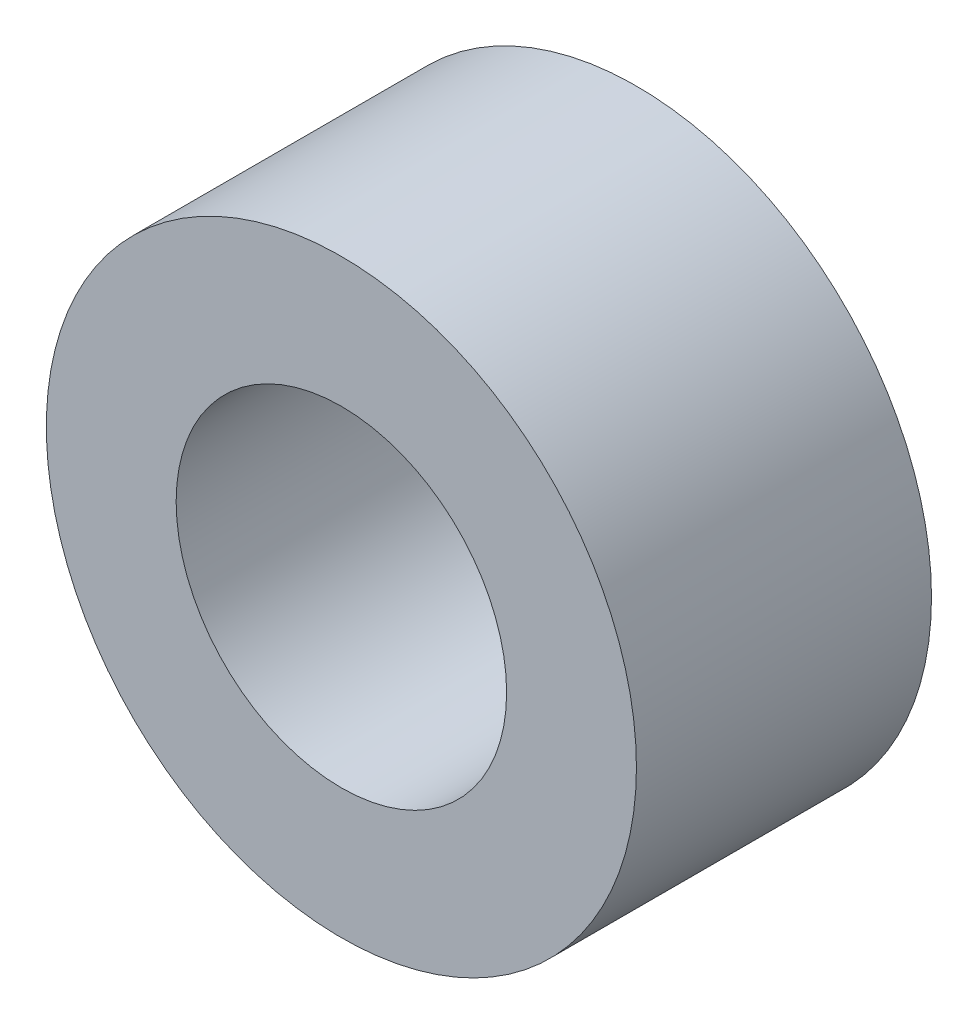
ISO-10303-21;
HEADER;
FILE_DESCRIPTION(('STEP AP214'),'2;1');
FILE_NAME('part.step','',(''),(''),'','','');
FILE_SCHEMA(('AUTOMOTIVE_DESIGN { 1 0 10303 214 1 1 1 1 }'));
ENDSEC;
DATA;
#1=APPLICATION_CONTEXT('core data for automotive mechanical design processes');
#2=APPLICATION_PROTOCOL_DEFINITION('international standard','automotive_design',2000,#1);
#3=PRODUCT_CONTEXT('',#1,'mechanical');
#4=PRODUCT('Part','Part','',(#3));
#5=PRODUCT_RELATED_PRODUCT_CATEGORY('part','',(#4));
#6=PRODUCT_DEFINITION_FORMATION('','',#4);
#7=PRODUCT_DEFINITION_CONTEXT('part definition',#1,'design');
#8=PRODUCT_DEFINITION('design','',#6,#7);
#9=PRODUCT_DEFINITION_SHAPE('','',#8);
#10=(LENGTH_UNIT() NAMED_UNIT(*) SI_UNIT(.MILLI.,.METRE.));
#11=(NAMED_UNIT(*) PLANE_ANGLE_UNIT() SI_UNIT($,.RADIAN.));
#12=(NAMED_UNIT(*) SI_UNIT($,.STERADIAN.) SOLID_ANGLE_UNIT());
#13=UNCERTAINTY_MEASURE_WITH_UNIT(LENGTH_MEASURE(1.E-05),#10,'distance_accuracy_value','');
#14=(GEOMETRIC_REPRESENTATION_CONTEXT(3) GLOBAL_UNCERTAINTY_ASSIGNED_CONTEXT((#13)) GLOBAL_UNIT_ASSIGNED_CONTEXT((#10,
#11,#12)) REPRESENTATION_CONTEXT('',''));
#15=CARTESIAN_POINT('',(0.,0.,0.));
#16=DIRECTION('',(0.,0.,1.));
#17=DIRECTION('',(1.,0.,0.));
#18=AXIS2_PLACEMENT_3D('',#15,#16,#17);
#19=CARTESIAN_POINT('',(0.,0.,3.175));
#20=DIRECTION('',(0.,0.,-1.));
#21=DIRECTION('',(-1.,0.,0.));
#22=AXIS2_PLACEMENT_3D('',#19,#20,#21);
#23=CYLINDRICAL_SURFACE('',#22,3.175);
#24=CARTESIAN_POINT('',(0.,0.,3.175));
#25=DIRECTION('',(0.,0.,1.));
#26=DIRECTION('',(1.,0.,0.));
#27=AXIS2_PLACEMENT_3D('',#24,#25,#26);
#28=CIRCLE('',#27,3.175);
#29=CARTESIAN_POINT('',(3.175,0.,3.175));
#30=VERTEX_POINT('',#29);
#31=EDGE_CURVE('E10',#30,#30,#28,.T.);
#32=ORIENTED_EDGE('',*,*,#31,.F.);
#33=EDGE_LOOP('',(#32));
#34=FACE_BOUND('',#33,.T.);
#35=CARTESIAN_POINT('',(0.,0.,0.));
#36=DIRECTION('',(0.,0.,1.));
#37=DIRECTION('',(1.,0.,0.));
#38=AXIS2_PLACEMENT_3D('',#35,#36,#37);
#39=CIRCLE('',#38,3.175);
#40=CARTESIAN_POINT('',(3.175,0.,0.));
#41=VERTEX_POINT('',#40);
#42=EDGE_CURVE('E40',#41,#41,#39,.T.);
#43=ORIENTED_EDGE('',*,*,#42,.T.);
#44=EDGE_LOOP('',(#43));
#45=FACE_BOUND('',#44,.T.);
#46=ADVANCED_FACE('F37',(#34,#45),#23,.T.);
#47=CARTESIAN_POINT('',(0.,0.,3.175));
#48=DIRECTION('',(0.,0.,1.));
#49=DIRECTION('',(1.,0.,0.));
#50=AXIS2_PLACEMENT_3D('',#47,#48,#49);
#51=PLANE('',#50);
#52=CARTESIAN_POINT('',(0.,0.,3.175));
#53=DIRECTION('',(0.,0.,1.));
#54=DIRECTION('',(1.,0.,0.));
#55=AXIS2_PLACEMENT_3D('',#52,#53,#54);
#56=CIRCLE('',#55,1.778);
#57=CARTESIAN_POINT('',(1.778,0.,3.175));
#58=VERTEX_POINT('',#57);
#59=EDGE_CURVE('E51',#58,#58,#56,.T.);
#60=ORIENTED_EDGE('',*,*,#59,.F.);
#61=EDGE_LOOP('',(#60));
#62=FACE_BOUND('',#61,.T.);
#63=ORIENTED_EDGE('',*,*,#31,.T.);
#64=EDGE_LOOP('',(#63));
#65=FACE_BOUND('',#64,.T.);
#66=ADVANCED_FACE('F68',(#62,#65),#51,.T.);
#67=CARTESIAN_POINT('',(0.,0.,0.));
#68=DIRECTION('',(0.,0.,1.));
#69=DIRECTION('',(1.,0.,0.));
#70=AXIS2_PLACEMENT_3D('',#67,#68,#69);
#71=PLANE('',#70);
#72=CARTESIAN_POINT('',(0.,0.,0.));
#73=DIRECTION('',(0.,0.,1.));
#74=DIRECTION('',(1.,0.,0.));
#75=AXIS2_PLACEMENT_3D('',#72,#73,#74);
#76=CIRCLE('',#75,1.778);
#77=CARTESIAN_POINT('',(1.778,0.,0.));
#78=VERTEX_POINT('',#77);
#79=EDGE_CURVE('E49',#78,#78,#76,.T.);
#80=ORIENTED_EDGE('',*,*,#79,.T.);
#81=EDGE_LOOP('',(#80));
#82=FACE_BOUND('',#81,.T.);
#83=ORIENTED_EDGE('',*,*,#42,.F.);
#84=EDGE_LOOP('',(#83));
#85=FACE_BOUND('',#84,.T.);
#86=ADVANCED_FACE('F59',(#82,#85),#71,.F.);
#87=CARTESIAN_POINT('',(0.,0.,0.));
#88=DIRECTION('',(0.,0.,1.));
#89=DIRECTION('',(1.,0.,0.));
#90=AXIS2_PLACEMENT_3D('',#87,#88,#89);
#91=CYLINDRICAL_SURFACE('',#90,1.778);
#92=ORIENTED_EDGE('',*,*,#79,.F.);
#93=EDGE_LOOP('',(#92));
#94=FACE_BOUND('',#93,.T.);
#95=ORIENTED_EDGE('',*,*,#59,.T.);
#96=EDGE_LOOP('',(#95));
#97=FACE_BOUND('',#96,.T.);
#98=ADVANCED_FACE('F62',(#94,#97),#91,.F.);
#99=CLOSED_SHELL('',(#46,#66,#86,#98));
#100=MANIFOLD_SOLID_BREP('B2',#99);
#101=ADVANCED_BREP_SHAPE_REPRESENTATION('',(#18,#100),#14);
#102=SHAPE_DEFINITION_REPRESENTATION(#9,#101);
ENDSEC;
END-ISO-10303-21;
